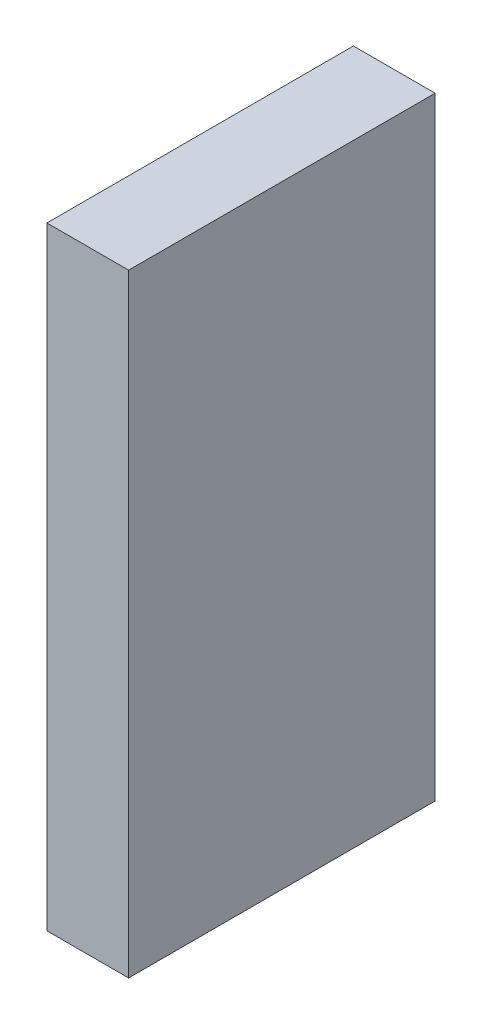
ISO-10303-21;
HEADER;
FILE_DESCRIPTION(('STEP AP214'),'2;1');
FILE_NAME('part.step','',(''),(''),'','','');
FILE_SCHEMA(('AUTOMOTIVE_DESIGN { 1 0 10303 214 1 1 1 1 }'));
ENDSEC;
DATA;
#1=APPLICATION_CONTEXT('core data for automotive mechanical design processes');
#2=APPLICATION_PROTOCOL_DEFINITION('international standard','automotive_design',2000,#1);
#3=PRODUCT_CONTEXT('',#1,'mechanical');
#4=PRODUCT('Part','Part','',(#3));
#5=PRODUCT_RELATED_PRODUCT_CATEGORY('part','',(#4));
#6=PRODUCT_DEFINITION_FORMATION('','',#4);
#7=PRODUCT_DEFINITION_CONTEXT('part definition',#1,'design');
#8=PRODUCT_DEFINITION('design','',#6,#7);
#9=PRODUCT_DEFINITION_SHAPE('','',#8);
#10=(LENGTH_UNIT() NAMED_UNIT(*) SI_UNIT(.MILLI.,.METRE.));
#11=(NAMED_UNIT(*) PLANE_ANGLE_UNIT() SI_UNIT($,.RADIAN.));
#12=(NAMED_UNIT(*) SI_UNIT($,.STERADIAN.) SOLID_ANGLE_UNIT());
#13=UNCERTAINTY_MEASURE_WITH_UNIT(LENGTH_MEASURE(1.E-05),#10,'distance_accuracy_value','');
#14=(GEOMETRIC_REPRESENTATION_CONTEXT(3) GLOBAL_UNCERTAINTY_ASSIGNED_CONTEXT((#13)) GLOBAL_UNIT_ASSIGNED_CONTEXT((#10,
#11,#12)) REPRESENTATION_CONTEXT('',''));
#15=CARTESIAN_POINT('',(0.,0.,0.));
#16=DIRECTION('',(0.,0.,1.));
#17=DIRECTION('',(1.,0.,0.));
#18=AXIS2_PLACEMENT_3D('',#15,#16,#17);
#19=CARTESIAN_POINT('',(346.,700.,-215.));
#20=DIRECTION('',(-1.,0.,0.));
#21=DIRECTION('',(0.,0.,1.));
#22=AXIS2_PLACEMENT_3D('',#19,#20,#21);
#23=PLANE('',#22);
#24=DIRECTION('',(0.,-1.,0.));
#25=VECTOR('',#24,1.);
#26=CARTESIAN_POINT('',(346.,700.,-185.));
#27=LINE('',#26,#25);
#28=CARTESIAN_POINT('',(346.,760.,-185.));
#29=VERTEX_POINT('',#28);
#30=CARTESIAN_POINT('',(346.,700.,-185.));
#31=VERTEX_POINT('',#30);
#32=EDGE_CURVE('E103',#29,#31,#27,.T.);
#33=ORIENTED_EDGE('',*,*,#32,.F.);
#34=DIRECTION('',(0.,0.,1.));
#35=VECTOR('',#34,1.);
#36=CARTESIAN_POINT('',(346.,760.,-215.));
#37=LINE('',#36,#35);
#38=CARTESIAN_POINT('',(346.,760.,-215.));
#39=VERTEX_POINT('',#38);
#40=EDGE_CURVE('E11',#39,#29,#37,.T.);
#41=ORIENTED_EDGE('',*,*,#40,.F.);
#42=DIRECTION('',(0.,-1.,0.));
#43=VECTOR('',#42,1.);
#44=CARTESIAN_POINT('',(346.,700.,-215.));
#45=LINE('',#44,#43);
#46=CARTESIAN_POINT('',(346.,700.,-215.));
#47=VERTEX_POINT('',#46);
#48=EDGE_CURVE('E97',#39,#47,#45,.T.);
#49=ORIENTED_EDGE('',*,*,#48,.T.);
#50=DIRECTION('',(0.,0.,1.));
#51=VECTOR('',#50,1.);
#52=CARTESIAN_POINT('',(346.,700.,-215.));
#53=LINE('',#52,#51);
#54=EDGE_CURVE('E42',#47,#31,#53,.T.);
#55=ORIENTED_EDGE('',*,*,#54,.T.);
#56=EDGE_LOOP('',(#33,#41,#49,#55));
#57=FACE_BOUND('',#56,.T.);
#58=ADVANCED_FACE('F39',(#57),#23,.T.);
#59=CARTESIAN_POINT('',(346.,760.,-215.));
#60=DIRECTION('',(0.,1.,0.));
#61=DIRECTION('',(0.,0.,1.));
#62=AXIS2_PLACEMENT_3D('',#59,#60,#61);
#63=PLANE('',#62);
#64=DIRECTION('',(-1.,0.,0.));
#65=VECTOR('',#64,1.);
#66=CARTESIAN_POINT('',(346.,760.,-185.));
#67=LINE('',#66,#65);
#68=CARTESIAN_POINT('',(354.,760.,-185.));
#69=VERTEX_POINT('',#68);
#70=EDGE_CURVE('E99',#69,#29,#67,.T.);
#71=ORIENTED_EDGE('',*,*,#70,.F.);
#72=DIRECTION('',(0.,0.,1.));
#73=VECTOR('',#72,1.);
#74=CARTESIAN_POINT('',(354.,760.,-215.));
#75=LINE('',#74,#73);
#76=CARTESIAN_POINT('',(354.,760.,-215.));
#77=VERTEX_POINT('',#76);
#78=EDGE_CURVE('E48',#77,#69,#75,.T.);
#79=ORIENTED_EDGE('',*,*,#78,.F.);
#80=DIRECTION('',(-1.,0.,0.));
#81=VECTOR('',#80,1.);
#82=CARTESIAN_POINT('',(346.,760.,-215.));
#83=LINE('',#82,#81);
#84=EDGE_CURVE('E94',#77,#39,#83,.T.);
#85=ORIENTED_EDGE('',*,*,#84,.T.);
#86=ORIENTED_EDGE('',*,*,#40,.T.);
#87=EDGE_LOOP('',(#71,#79,#85,#86));
#88=FACE_BOUND('',#87,.T.);
#89=ADVANCED_FACE('F113',(#88),#63,.T.);
#90=CARTESIAN_POINT('',(354.,700.,-215.));
#91=DIRECTION('',(1.,0.,0.));
#92=DIRECTION('',(0.,0.,-1.));
#93=AXIS2_PLACEMENT_3D('',#90,#91,#92);
#94=PLANE('',#93);
#95=DIRECTION('',(0.,1.,0.));
#96=VECTOR('',#95,1.);
#97=CARTESIAN_POINT('',(354.,700.,-185.));
#98=LINE('',#97,#96);
#99=CARTESIAN_POINT('',(354.,700.,-185.));
#100=VERTEX_POINT('',#99);
#101=EDGE_CURVE('E89',#100,#69,#98,.T.);
#102=ORIENTED_EDGE('',*,*,#101,.F.);
#103=DIRECTION('',(0.,0.,1.));
#104=VECTOR('',#103,1.);
#105=CARTESIAN_POINT('',(354.,700.,-215.));
#106=LINE('',#105,#104);
#107=CARTESIAN_POINT('',(354.,700.,-215.));
#108=VERTEX_POINT('',#107);
#109=EDGE_CURVE('E84',#108,#100,#106,.T.);
#110=ORIENTED_EDGE('',*,*,#109,.F.);
#111=DIRECTION('',(0.,1.,0.));
#112=VECTOR('',#111,1.);
#113=CARTESIAN_POINT('',(354.,700.,-215.));
#114=LINE('',#113,#112);
#115=EDGE_CURVE('E87',#108,#77,#114,.T.);
#116=ORIENTED_EDGE('',*,*,#115,.T.);
#117=ORIENTED_EDGE('',*,*,#78,.T.);
#118=EDGE_LOOP('',(#102,#110,#116,#117));
#119=FACE_BOUND('',#118,.T.);
#120=ADVANCED_FACE('F86',(#119),#94,.T.);
#121=CARTESIAN_POINT('',(346.,700.,-215.));
#122=DIRECTION('',(0.,-1.,0.));
#123=DIRECTION('',(0.,0.,-1.));
#124=AXIS2_PLACEMENT_3D('',#121,#122,#123);
#125=PLANE('',#124);
#126=DIRECTION('',(1.,0.,0.));
#127=VECTOR('',#126,1.);
#128=CARTESIAN_POINT('',(346.,700.,-185.));
#129=LINE('',#128,#127);
#130=EDGE_CURVE('E106',#31,#100,#129,.T.);
#131=ORIENTED_EDGE('',*,*,#130,.F.);
#132=ORIENTED_EDGE('',*,*,#54,.F.);
#133=DIRECTION('',(1.,0.,0.));
#134=VECTOR('',#133,1.);
#135=CARTESIAN_POINT('',(346.,700.,-215.));
#136=LINE('',#135,#134);
#137=EDGE_CURVE('E93',#47,#108,#136,.T.);
#138=ORIENTED_EDGE('',*,*,#137,.T.);
#139=ORIENTED_EDGE('',*,*,#109,.T.);
#140=EDGE_LOOP('',(#131,#132,#138,#139));
#141=FACE_BOUND('',#140,.T.);
#142=ADVANCED_FACE('F96',(#141),#125,.T.);
#143=CARTESIAN_POINT('',(0.,0.,-215.));
#144=DIRECTION('',(0.,0.,-1.));
#145=DIRECTION('',(-1.,0.,0.));
#146=AXIS2_PLACEMENT_3D('',#143,#144,#145);
#147=PLANE('',#146);
#148=ORIENTED_EDGE('',*,*,#48,.F.);
#149=ORIENTED_EDGE('',*,*,#84,.F.);
#150=ORIENTED_EDGE('',*,*,#115,.F.);
#151=ORIENTED_EDGE('',*,*,#137,.F.);
#152=EDGE_LOOP('',(#148,#149,#150,#151));
#153=FACE_BOUND('',#152,.T.);
#154=ADVANCED_FACE('F92',(#153),#147,.T.);
#155=CARTESIAN_POINT('',(0.,0.,-185.));
#156=DIRECTION('',(0.,0.,-1.));
#157=DIRECTION('',(-1.,0.,0.));
#158=AXIS2_PLACEMENT_3D('',#155,#156,#157);
#159=PLANE('',#158);
#160=ORIENTED_EDGE('',*,*,#32,.T.);
#161=ORIENTED_EDGE('',*,*,#130,.T.);
#162=ORIENTED_EDGE('',*,*,#101,.T.);
#163=ORIENTED_EDGE('',*,*,#70,.T.);
#164=EDGE_LOOP('',(#160,#161,#162,#163));
#165=FACE_BOUND('',#164,.T.);
#166=ADVANCED_FACE('F112',(#165),#159,.F.);
#167=CLOSED_SHELL('',(#58,#89,#120,#142,#154,#166));
#168=MANIFOLD_SOLID_BREP('B2',#167);
#169=ADVANCED_BREP_SHAPE_REPRESENTATION('',(#18,#168),#14);
#170=SHAPE_DEFINITION_REPRESENTATION(#9,#169);
ENDSEC;
END-ISO-10303-21;
